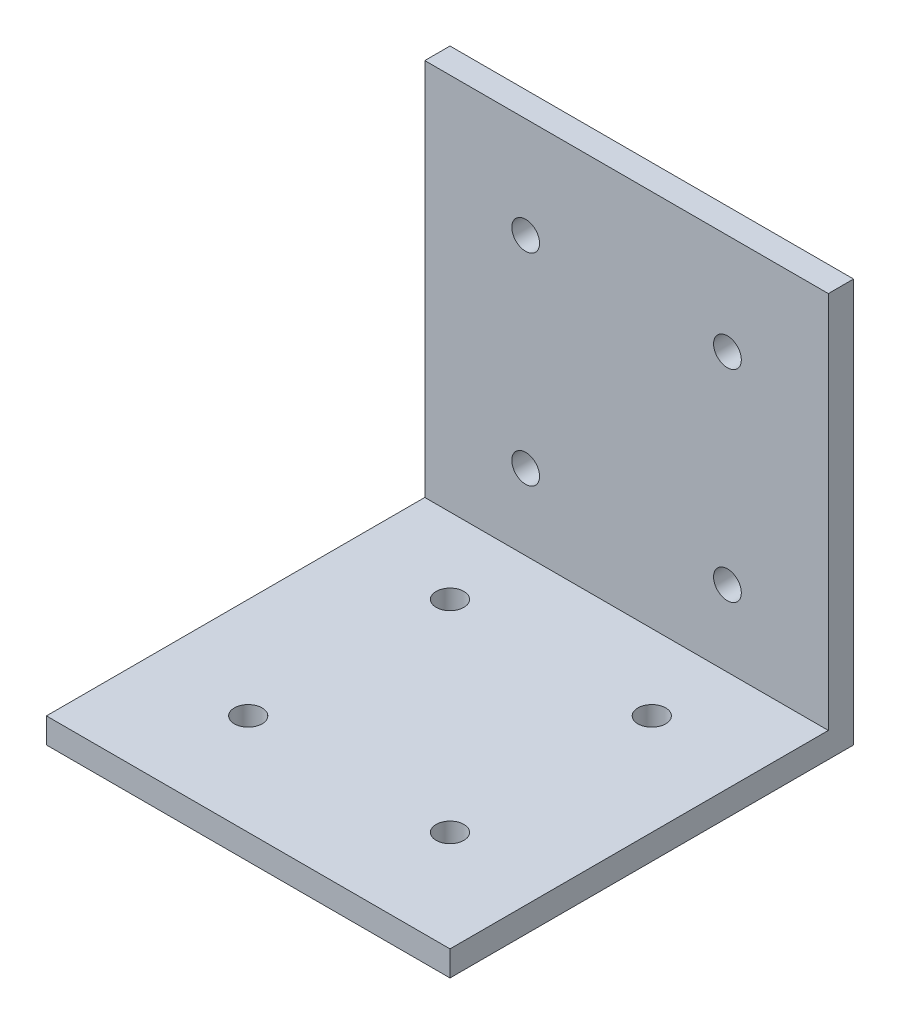
ISO-10303-21;
HEADER;
FILE_DESCRIPTION(('STEP AP214'),'2;1');
FILE_NAME('part.step','',(''),(''),'','','');
FILE_SCHEMA(('AUTOMOTIVE_DESIGN { 1 0 10303 214 1 1 1 1 }'));
ENDSEC;
DATA;
#1=APPLICATION_CONTEXT('core data for automotive mechanical design processes');
#2=APPLICATION_PROTOCOL_DEFINITION('international standard','automotive_design',2000,#1);
#3=PRODUCT_CONTEXT('',#1,'mechanical');
#4=PRODUCT('Part','Part','',(#3));
#5=PRODUCT_RELATED_PRODUCT_CATEGORY('part','',(#4));
#6=PRODUCT_DEFINITION_FORMATION('','',#4);
#7=PRODUCT_DEFINITION_CONTEXT('part definition',#1,'design');
#8=PRODUCT_DEFINITION('design','',#6,#7);
#9=PRODUCT_DEFINITION_SHAPE('','',#8);
#10=(LENGTH_UNIT() NAMED_UNIT(*) SI_UNIT(.MILLI.,.METRE.));
#11=(NAMED_UNIT(*) PLANE_ANGLE_UNIT() SI_UNIT($,.RADIAN.));
#12=(NAMED_UNIT(*) SI_UNIT($,.STERADIAN.) SOLID_ANGLE_UNIT());
#13=UNCERTAINTY_MEASURE_WITH_UNIT(LENGTH_MEASURE(1.E-05),#10,'distance_accuracy_value','');
#14=(GEOMETRIC_REPRESENTATION_CONTEXT(3) GLOBAL_UNCERTAINTY_ASSIGNED_CONTEXT((#13)) GLOBAL_UNIT_ASSIGNED_CONTEXT((#10,
#11,#12)) REPRESENTATION_CONTEXT('',''));
#15=CARTESIAN_POINT('',(0.,0.,0.));
#16=DIRECTION('',(0.,0.,1.));
#17=DIRECTION('',(1.,0.,0.));
#18=AXIS2_PLACEMENT_3D('',#15,#16,#17);
#19=CARTESIAN_POINT('',(0.,6.35,0.));
#20=DIRECTION('',(0.,1.,0.));
#21=DIRECTION('',(0.,0.,1.));
#22=AXIS2_PLACEMENT_3D('',#19,#20,#21);
#23=PLANE('',#22);
#24=DIRECTION('',(1.,0.,0.));
#25=VECTOR('',#24,1.);
#26=CARTESIAN_POINT('',(-50.8,6.35,-44.45));
#27=LINE('',#26,#25);
#28=CARTESIAN_POINT('',(-50.8,6.35,-44.45));
#29=VERTEX_POINT('',#28);
#30=CARTESIAN_POINT('',(50.8,6.35,-44.45));
#31=VERTEX_POINT('',#30);
#32=EDGE_CURVE('E55',#29,#31,#27,.T.);
#33=ORIENTED_EDGE('',*,*,#32,.F.);
#34=DIRECTION('',(0.,0.,1.));
#35=VECTOR('',#34,1.);
#36=CARTESIAN_POINT('',(-50.8,6.35,-50.8));
#37=LINE('',#36,#35);
#38=CARTESIAN_POINT('',(-50.8,6.35,50.8));
#39=VERTEX_POINT('',#38);
#40=EDGE_CURVE('E187',#29,#39,#37,.T.);
#41=ORIENTED_EDGE('',*,*,#40,.T.);
#42=DIRECTION('',(1.,0.,0.));
#43=VECTOR('',#42,1.);
#44=CARTESIAN_POINT('',(-50.8,6.35,50.8));
#45=LINE('',#44,#43);
#46=CARTESIAN_POINT('',(50.8,6.35,50.8));
#47=VERTEX_POINT('',#46);
#48=EDGE_CURVE('E61',#39,#47,#45,.T.);
#49=ORIENTED_EDGE('',*,*,#48,.T.);
#50=DIRECTION('',(0.,0.,-1.));
#51=VECTOR('',#50,1.);
#52=CARTESIAN_POINT('',(50.8,6.35,-50.8));
#53=LINE('',#52,#51);
#54=EDGE_CURVE('E91',#47,#31,#53,.T.);
#55=ORIENTED_EDGE('',*,*,#54,.T.);
#56=EDGE_LOOP('',(#33,#41,#49,#55));
#57=FACE_BOUND('',#56,.T.);
#58=CARTESIAN_POINT('',(25.4,6.35,25.4));
#59=DIRECTION('',(0.,1.,0.));
#60=DIRECTION('',(0.,0.,1.));
#61=AXIS2_PLACEMENT_3D('',#58,#59,#60);
#62=CIRCLE('',#61,3.4925);
#63=CARTESIAN_POINT('',(25.4,6.35,28.8925));
#64=VERTEX_POINT('',#63);
#65=EDGE_CURVE('E168',#64,#64,#62,.T.);
#66=ORIENTED_EDGE('',*,*,#65,.F.);
#67=EDGE_LOOP('',(#66));
#68=FACE_BOUND('',#67,.T.);
#69=CARTESIAN_POINT('',(-25.4,6.35,-25.4));
#70=DIRECTION('',(0.,1.,0.));
#71=DIRECTION('',(0.,0.,1.));
#72=AXIS2_PLACEMENT_3D('',#69,#70,#71);
#73=CIRCLE('',#72,3.4925);
#74=CARTESIAN_POINT('',(-25.4,6.35,-21.9075));
#75=VERTEX_POINT('',#74);
#76=EDGE_CURVE('E105',#75,#75,#73,.T.);
#77=ORIENTED_EDGE('',*,*,#76,.F.);
#78=EDGE_LOOP('',(#77));
#79=FACE_BOUND('',#78,.T.);
#80=CARTESIAN_POINT('',(25.4,6.35,-25.4));
#81=DIRECTION('',(0.,1.,0.));
#82=DIRECTION('',(0.,0.,1.));
#83=AXIS2_PLACEMENT_3D('',#80,#81,#82);
#84=CIRCLE('',#83,3.4925);
#85=CARTESIAN_POINT('',(25.4,6.35,-21.9075));
#86=VERTEX_POINT('',#85);
#87=EDGE_CURVE('E176',#86,#86,#84,.T.);
#88=ORIENTED_EDGE('',*,*,#87,.F.);
#89=EDGE_LOOP('',(#88));
#90=FACE_BOUND('',#89,.T.);
#91=CARTESIAN_POINT('',(-25.4,6.35,25.4));
#92=DIRECTION('',(0.,1.,0.));
#93=DIRECTION('',(0.,0.,1.));
#94=AXIS2_PLACEMENT_3D('',#91,#92,#93);
#95=CIRCLE('',#94,3.4925);
#96=CARTESIAN_POINT('',(-25.4,6.35,28.8925));
#97=VERTEX_POINT('',#96);
#98=EDGE_CURVE('E160',#97,#97,#95,.T.);
#99=ORIENTED_EDGE('',*,*,#98,.F.);
#100=EDGE_LOOP('',(#99));
#101=FACE_BOUND('',#100,.T.);
#102=ADVANCED_FACE('F39',(#57,#68,#79,#90,#101),#23,.T.);
#103=CARTESIAN_POINT('',(0.,0.,0.));
#104=DIRECTION('',(0.,1.,0.));
#105=DIRECTION('',(0.,0.,1.));
#106=AXIS2_PLACEMENT_3D('',#103,#104,#105);
#107=PLANE('',#106);
#108=DIRECTION('',(0.,0.,-1.));
#109=VECTOR('',#108,1.);
#110=CARTESIAN_POINT('',(50.8,0.,-50.8));
#111=LINE('',#110,#109);
#112=CARTESIAN_POINT('',(50.8,0.,50.8));
#113=VERTEX_POINT('',#112);
#114=CARTESIAN_POINT('',(50.8,0.,-50.8));
#115=VERTEX_POINT('',#114);
#116=EDGE_CURVE('E97',#113,#115,#111,.T.);
#117=ORIENTED_EDGE('',*,*,#116,.F.);
#118=DIRECTION('',(1.,0.,0.));
#119=VECTOR('',#118,1.);
#120=CARTESIAN_POINT('',(-50.8,0.,50.8));
#121=LINE('',#120,#119);
#122=CARTESIAN_POINT('',(-50.8,0.,50.8));
#123=VERTEX_POINT('',#122);
#124=EDGE_CURVE('E80',#123,#113,#121,.T.);
#125=ORIENTED_EDGE('',*,*,#124,.F.);
#126=DIRECTION('',(0.,0.,1.));
#127=VECTOR('',#126,1.);
#128=CARTESIAN_POINT('',(-50.8,0.,-50.8));
#129=LINE('',#128,#127);
#130=CARTESIAN_POINT('',(-50.8,0.,-50.8));
#131=VERTEX_POINT('',#130);
#132=EDGE_CURVE('E92',#131,#123,#129,.T.);
#133=ORIENTED_EDGE('',*,*,#132,.F.);
#134=DIRECTION('',(-1.,0.,0.));
#135=VECTOR('',#134,1.);
#136=CARTESIAN_POINT('',(-50.8,0.,-50.8));
#137=LINE('',#136,#135);
#138=EDGE_CURVE('E103',#115,#131,#137,.T.);
#139=ORIENTED_EDGE('',*,*,#138,.F.);
#140=EDGE_LOOP('',(#117,#125,#133,#139));
#141=FACE_BOUND('',#140,.T.);
#142=CARTESIAN_POINT('',(-25.4,0.,-25.4));
#143=DIRECTION('',(0.,1.,0.));
#144=DIRECTION('',(0.,0.,1.));
#145=AXIS2_PLACEMENT_3D('',#142,#143,#144);
#146=CIRCLE('',#145,3.4925);
#147=CARTESIAN_POINT('',(-25.4,0.,-21.9075));
#148=VERTEX_POINT('',#147);
#149=EDGE_CURVE('E111',#148,#148,#146,.T.);
#150=ORIENTED_EDGE('',*,*,#149,.T.);
#151=EDGE_LOOP('',(#150));
#152=FACE_BOUND('',#151,.T.);
#153=CARTESIAN_POINT('',(25.4,0.,-25.4));
#154=DIRECTION('',(0.,1.,0.));
#155=DIRECTION('',(0.,0.,1.));
#156=AXIS2_PLACEMENT_3D('',#153,#154,#155);
#157=CIRCLE('',#156,3.4925);
#158=CARTESIAN_POINT('',(25.4,0.,-21.9075));
#159=VERTEX_POINT('',#158);
#160=EDGE_CURVE('E172',#159,#159,#157,.T.);
#161=ORIENTED_EDGE('',*,*,#160,.T.);
#162=EDGE_LOOP('',(#161));
#163=FACE_BOUND('',#162,.T.);
#164=CARTESIAN_POINT('',(25.4,0.,25.4));
#165=DIRECTION('',(0.,1.,0.));
#166=DIRECTION('',(0.,0.,1.));
#167=AXIS2_PLACEMENT_3D('',#164,#165,#166);
#168=CIRCLE('',#167,3.4925);
#169=CARTESIAN_POINT('',(25.4,0.,28.8925));
#170=VERTEX_POINT('',#169);
#171=EDGE_CURVE('E164',#170,#170,#168,.T.);
#172=ORIENTED_EDGE('',*,*,#171,.T.);
#173=EDGE_LOOP('',(#172));
#174=FACE_BOUND('',#173,.T.);
#175=CARTESIAN_POINT('',(-25.4,0.,25.4));
#176=DIRECTION('',(0.,1.,0.));
#177=DIRECTION('',(0.,0.,1.));
#178=AXIS2_PLACEMENT_3D('',#175,#176,#177);
#179=CIRCLE('',#178,3.4925);
#180=CARTESIAN_POINT('',(-25.4,0.,28.8925));
#181=VERTEX_POINT('',#180);
#182=EDGE_CURVE('E159',#181,#181,#179,.T.);
#183=ORIENTED_EDGE('',*,*,#182,.T.);
#184=EDGE_LOOP('',(#183));
#185=FACE_BOUND('',#184,.T.);
#186=ADVANCED_FACE('F101',(#141,#152,#163,#174,#185),#107,.F.);
#187=CARTESIAN_POINT('',(50.8,6.35,-50.8));
#188=DIRECTION('',(-1.,0.,0.));
#189=DIRECTION('',(0.,0.,1.));
#190=AXIS2_PLACEMENT_3D('',#187,#188,#189);
#191=PLANE('',#190);
#192=ORIENTED_EDGE('',*,*,#116,.T.);
#193=DIRECTION('',(0.,-1.,0.));
#194=VECTOR('',#193,1.);
#195=CARTESIAN_POINT('',(50.8,6.35,-50.8));
#196=LINE('',#195,#194);
#197=CARTESIAN_POINT('',(50.8,101.6,-50.8));
#198=VERTEX_POINT('',#197);
#199=EDGE_CURVE('E11',#198,#115,#196,.T.);
#200=ORIENTED_EDGE('',*,*,#199,.F.);
#201=DIRECTION('',(0.,0.,-1.));
#202=VECTOR('',#201,1.);
#203=CARTESIAN_POINT('',(50.8,101.6,-50.8));
#204=LINE('',#203,#202);
#205=CARTESIAN_POINT('',(50.8,101.6,-44.45));
#206=VERTEX_POINT('',#205);
#207=EDGE_CURVE('E141',#206,#198,#204,.T.);
#208=ORIENTED_EDGE('',*,*,#207,.F.);
#209=DIRECTION('',(0.,-1.,0.));
#210=VECTOR('',#209,1.);
#211=CARTESIAN_POINT('',(50.8,101.6,-44.45));
#212=LINE('',#211,#210);
#213=EDGE_CURVE('E143',#206,#31,#212,.T.);
#214=ORIENTED_EDGE('',*,*,#213,.T.);
#215=ORIENTED_EDGE('',*,*,#54,.F.);
#216=DIRECTION('',(0.,-1.,0.));
#217=VECTOR('',#216,1.);
#218=CARTESIAN_POINT('',(50.8,6.35,50.8));
#219=LINE('',#218,#217);
#220=EDGE_CURVE('E83',#47,#113,#219,.T.);
#221=ORIENTED_EDGE('',*,*,#220,.T.);
#222=EDGE_LOOP('',(#192,#200,#208,#214,#215,#221));
#223=FACE_BOUND('',#222,.T.);
#224=ADVANCED_FACE('F41',(#223),#191,.F.);
#225=CARTESIAN_POINT('',(-50.8,6.35,-50.8));
#226=DIRECTION('',(0.,0.,1.));
#227=DIRECTION('',(1.,0.,0.));
#228=AXIS2_PLACEMENT_3D('',#225,#226,#227);
#229=PLANE('',#228);
#230=CARTESIAN_POINT('',(25.4,76.2,-50.8));
#231=DIRECTION('',(0.,0.,-1.));
#232=DIRECTION('',(-1.,0.,0.));
#233=AXIS2_PLACEMENT_3D('',#230,#231,#232);
#234=CIRCLE('',#233,3.4925);
#235=CARTESIAN_POINT('',(21.9075,76.2,-50.8));
#236=VERTEX_POINT('',#235);
#237=EDGE_CURVE('E214',#236,#236,#234,.T.);
#238=ORIENTED_EDGE('',*,*,#237,.F.);
#239=EDGE_LOOP('',(#238));
#240=FACE_BOUND('',#239,.T.);
#241=CARTESIAN_POINT('',(-25.4,25.4,-50.8));
#242=DIRECTION('',(0.,0.,-1.));
#243=DIRECTION('',(-1.,0.,0.));
#244=AXIS2_PLACEMENT_3D('',#241,#242,#243);
#245=CIRCLE('',#244,3.4925);
#246=CARTESIAN_POINT('',(-28.8925,25.4,-50.8));
#247=VERTEX_POINT('',#246);
#248=EDGE_CURVE('E215',#247,#247,#245,.T.);
#249=ORIENTED_EDGE('',*,*,#248,.F.);
#250=EDGE_LOOP('',(#249));
#251=FACE_BOUND('',#250,.T.);
#252=CARTESIAN_POINT('',(25.4,25.4,-50.8));
#253=DIRECTION('',(0.,0.,-1.));
#254=DIRECTION('',(-1.,0.,0.));
#255=AXIS2_PLACEMENT_3D('',#252,#253,#254);
#256=CIRCLE('',#255,3.4925);
#257=CARTESIAN_POINT('',(21.9075,25.4,-50.8));
#258=VERTEX_POINT('',#257);
#259=EDGE_CURVE('E229',#258,#258,#256,.T.);
#260=ORIENTED_EDGE('',*,*,#259,.F.);
#261=EDGE_LOOP('',(#260));
#262=FACE_BOUND('',#261,.T.);
#263=CARTESIAN_POINT('',(-25.4,76.2,-50.8));
#264=DIRECTION('',(0.,0.,-1.));
#265=DIRECTION('',(-1.,0.,0.));
#266=AXIS2_PLACEMENT_3D('',#263,#264,#265);
#267=CIRCLE('',#266,3.4925);
#268=CARTESIAN_POINT('',(-28.8925,76.2,-50.8));
#269=VERTEX_POINT('',#268);
#270=EDGE_CURVE('E205',#269,#269,#267,.T.);
#271=ORIENTED_EDGE('',*,*,#270,.F.);
#272=EDGE_LOOP('',(#271));
#273=FACE_BOUND('',#272,.T.);
#274=ORIENTED_EDGE('',*,*,#138,.T.);
#275=DIRECTION('',(0.,-1.,0.));
#276=VECTOR('',#275,1.);
#277=CARTESIAN_POINT('',(-50.8,6.35,-50.8));
#278=LINE('',#277,#276);
#279=CARTESIAN_POINT('',(-50.8,101.6,-50.8));
#280=VERTEX_POINT('',#279);
#281=EDGE_CURVE('E48',#280,#131,#278,.T.);
#282=ORIENTED_EDGE('',*,*,#281,.F.);
#283=DIRECTION('',(-1.,0.,0.));
#284=VECTOR('',#283,1.);
#285=CARTESIAN_POINT('',(-50.8,101.6,-50.8));
#286=LINE('',#285,#284);
#287=EDGE_CURVE('E133',#198,#280,#286,.T.);
#288=ORIENTED_EDGE('',*,*,#287,.F.);
#289=ORIENTED_EDGE('',*,*,#199,.T.);
#290=EDGE_LOOP('',(#274,#282,#288,#289));
#291=FACE_BOUND('',#290,.T.);
#292=ADVANCED_FACE('F131',(#240,#251,#262,#273,#291),#229,.F.);
#293=CARTESIAN_POINT('',(-50.8,6.35,-50.8));
#294=DIRECTION('',(1.,0.,0.));
#295=DIRECTION('',(0.,0.,-1.));
#296=AXIS2_PLACEMENT_3D('',#293,#294,#295);
#297=PLANE('',#296);
#298=ORIENTED_EDGE('',*,*,#132,.T.);
#299=DIRECTION('',(0.,-1.,0.));
#300=VECTOR('',#299,1.);
#301=CARTESIAN_POINT('',(-50.8,6.35,50.8));
#302=LINE('',#301,#300);
#303=EDGE_CURVE('E86',#39,#123,#302,.T.);
#304=ORIENTED_EDGE('',*,*,#303,.F.);
#305=ORIENTED_EDGE('',*,*,#40,.F.);
#306=DIRECTION('',(0.,-1.,0.));
#307=VECTOR('',#306,1.);
#308=CARTESIAN_POINT('',(-50.8,101.6,-44.45));
#309=LINE('',#308,#307);
#310=CARTESIAN_POINT('',(-50.8,101.6,-44.45));
#311=VERTEX_POINT('',#310);
#312=EDGE_CURVE('E147',#311,#29,#309,.T.);
#313=ORIENTED_EDGE('',*,*,#312,.F.);
#314=DIRECTION('',(0.,0.,1.));
#315=VECTOR('',#314,1.);
#316=CARTESIAN_POINT('',(-50.8,101.6,-50.8));
#317=LINE('',#316,#315);
#318=EDGE_CURVE('E127',#280,#311,#317,.T.);
#319=ORIENTED_EDGE('',*,*,#318,.F.);
#320=ORIENTED_EDGE('',*,*,#281,.T.);
#321=EDGE_LOOP('',(#298,#304,#305,#313,#319,#320));
#322=FACE_BOUND('',#321,.T.);
#323=ADVANCED_FACE('F124',(#322),#297,.F.);
#324=CARTESIAN_POINT('',(-50.8,6.35,50.8));
#325=DIRECTION('',(0.,0.,-1.));
#326=DIRECTION('',(-1.,0.,0.));
#327=AXIS2_PLACEMENT_3D('',#324,#325,#326);
#328=PLANE('',#327);
#329=ORIENTED_EDGE('',*,*,#124,.T.);
#330=ORIENTED_EDGE('',*,*,#220,.F.);
#331=ORIENTED_EDGE('',*,*,#48,.F.);
#332=ORIENTED_EDGE('',*,*,#303,.T.);
#333=EDGE_LOOP('',(#329,#330,#331,#332));
#334=FACE_BOUND('',#333,.T.);
#335=ADVANCED_FACE('F82',(#334),#328,.F.);
#336=CARTESIAN_POINT('',(-25.4,6.35,-25.4));
#337=DIRECTION('',(0.,-1.,0.));
#338=DIRECTION('',(0.,0.,-1.));
#339=AXIS2_PLACEMENT_3D('',#336,#337,#338);
#340=CYLINDRICAL_SURFACE('',#339,3.4925);
#341=ORIENTED_EDGE('',*,*,#76,.T.);
#342=EDGE_LOOP('',(#341));
#343=FACE_BOUND('',#342,.T.);
#344=ORIENTED_EDGE('',*,*,#149,.F.);
#345=EDGE_LOOP('',(#344));
#346=FACE_BOUND('',#345,.T.);
#347=ADVANCED_FACE('F261',(#343,#346),#340,.F.);
#348=CARTESIAN_POINT('',(25.4,6.35,-25.4));
#349=DIRECTION('',(0.,-1.,0.));
#350=DIRECTION('',(0.,0.,-1.));
#351=AXIS2_PLACEMENT_3D('',#348,#349,#350);
#352=CYLINDRICAL_SURFACE('',#351,3.4925);
#353=ORIENTED_EDGE('',*,*,#87,.T.);
#354=EDGE_LOOP('',(#353));
#355=FACE_BOUND('',#354,.T.);
#356=ORIENTED_EDGE('',*,*,#160,.F.);
#357=EDGE_LOOP('',(#356));
#358=FACE_BOUND('',#357,.T.);
#359=ADVANCED_FACE('F285',(#355,#358),#352,.F.);
#360=CARTESIAN_POINT('',(25.4,6.35,25.4));
#361=DIRECTION('',(0.,-1.,0.));
#362=DIRECTION('',(0.,0.,-1.));
#363=AXIS2_PLACEMENT_3D('',#360,#361,#362);
#364=CYLINDRICAL_SURFACE('',#363,3.4925);
#365=ORIENTED_EDGE('',*,*,#65,.T.);
#366=EDGE_LOOP('',(#365));
#367=FACE_BOUND('',#366,.T.);
#368=ORIENTED_EDGE('',*,*,#171,.F.);
#369=EDGE_LOOP('',(#368));
#370=FACE_BOUND('',#369,.T.);
#371=ADVANCED_FACE('F292',(#367,#370),#364,.F.);
#372=CARTESIAN_POINT('',(-25.4,6.35,25.4));
#373=DIRECTION('',(0.,-1.,0.));
#374=DIRECTION('',(0.,0.,-1.));
#375=AXIS2_PLACEMENT_3D('',#372,#373,#374);
#376=CYLINDRICAL_SURFACE('',#375,3.4925);
#377=ORIENTED_EDGE('',*,*,#98,.T.);
#378=EDGE_LOOP('',(#377));
#379=FACE_BOUND('',#378,.T.);
#380=ORIENTED_EDGE('',*,*,#182,.F.);
#381=EDGE_LOOP('',(#380));
#382=FACE_BOUND('',#381,.T.);
#383=ADVANCED_FACE('F299',(#379,#382),#376,.F.);
#384=CARTESIAN_POINT('',(-50.8,101.6,-44.45));
#385=DIRECTION('',(0.,0.,-1.));
#386=DIRECTION('',(-1.,0.,0.));
#387=AXIS2_PLACEMENT_3D('',#384,#385,#386);
#388=PLANE('',#387);
#389=CARTESIAN_POINT('',(25.4,76.2,-44.45));
#390=DIRECTION('',(0.,0.,-1.));
#391=DIRECTION('',(-1.,0.,0.));
#392=AXIS2_PLACEMENT_3D('',#389,#390,#391);
#393=CIRCLE('',#392,3.4925);
#394=CARTESIAN_POINT('',(21.9075,76.2,-44.45));
#395=VERTEX_POINT('',#394);
#396=EDGE_CURVE('E209',#395,#395,#393,.F.);
#397=ORIENTED_EDGE('',*,*,#396,.F.);
#398=EDGE_LOOP('',(#397));
#399=FACE_BOUND('',#398,.T.);
#400=CARTESIAN_POINT('',(-25.4,25.4,-44.45));
#401=DIRECTION('',(0.,0.,-1.));
#402=DIRECTION('',(-1.,0.,0.));
#403=AXIS2_PLACEMENT_3D('',#400,#401,#402);
#404=CIRCLE('',#403,3.4925);
#405=CARTESIAN_POINT('',(-28.8925,25.4,-44.45));
#406=VERTEX_POINT('',#405);
#407=EDGE_CURVE('E210',#406,#406,#404,.F.);
#408=ORIENTED_EDGE('',*,*,#407,.F.);
#409=EDGE_LOOP('',(#408));
#410=FACE_BOUND('',#409,.T.);
#411=CARTESIAN_POINT('',(25.4,25.4,-44.45));
#412=DIRECTION('',(0.,0.,-1.));
#413=DIRECTION('',(-1.,0.,0.));
#414=AXIS2_PLACEMENT_3D('',#411,#412,#413);
#415=CIRCLE('',#414,3.4925);
#416=CARTESIAN_POINT('',(21.9075,25.4,-44.45));
#417=VERTEX_POINT('',#416);
#418=EDGE_CURVE('E219',#417,#417,#415,.F.);
#419=ORIENTED_EDGE('',*,*,#418,.F.);
#420=EDGE_LOOP('',(#419));
#421=FACE_BOUND('',#420,.T.);
#422=CARTESIAN_POINT('',(-25.4,76.2,-44.45));
#423=DIRECTION('',(0.,0.,-1.));
#424=DIRECTION('',(-1.,0.,0.));
#425=AXIS2_PLACEMENT_3D('',#422,#423,#424);
#426=CIRCLE('',#425,3.4925);
#427=CARTESIAN_POINT('',(-28.8925,76.2,-44.45));
#428=VERTEX_POINT('',#427);
#429=EDGE_CURVE('E154',#428,#428,#426,.F.);
#430=ORIENTED_EDGE('',*,*,#429,.F.);
#431=EDGE_LOOP('',(#430));
#432=FACE_BOUND('',#431,.T.);
#433=ORIENTED_EDGE('',*,*,#32,.T.);
#434=ORIENTED_EDGE('',*,*,#213,.F.);
#435=DIRECTION('',(1.,0.,0.));
#436=VECTOR('',#435,1.);
#437=CARTESIAN_POINT('',(-50.8,101.6,-44.45));
#438=LINE('',#437,#436);
#439=EDGE_CURVE('E149',#311,#206,#438,.T.);
#440=ORIENTED_EDGE('',*,*,#439,.F.);
#441=ORIENTED_EDGE('',*,*,#312,.T.);
#442=EDGE_LOOP('',(#433,#434,#440,#441));
#443=FACE_BOUND('',#442,.T.);
#444=ADVANCED_FACE('F193',(#399,#410,#421,#432,#443),#388,.F.);
#445=CARTESIAN_POINT('',(0.,101.6,0.));
#446=DIRECTION('',(0.,1.,0.));
#447=DIRECTION('',(0.,0.,1.));
#448=AXIS2_PLACEMENT_3D('',#445,#446,#447);
#449=PLANE('',#448);
#450=ORIENTED_EDGE('',*,*,#318,.T.);
#451=ORIENTED_EDGE('',*,*,#439,.T.);
#452=ORIENTED_EDGE('',*,*,#207,.T.);
#453=ORIENTED_EDGE('',*,*,#287,.T.);
#454=EDGE_LOOP('',(#450,#451,#452,#453));
#455=FACE_BOUND('',#454,.T.);
#456=ADVANCED_FACE('F137',(#455),#449,.T.);
#457=CARTESIAN_POINT('',(-25.4,76.2,-34.5717182668239));
#458=DIRECTION('',(0.,0.,-1.));
#459=DIRECTION('',(-1.,0.,0.));
#460=AXIS2_PLACEMENT_3D('',#457,#458,#459);
#461=CYLINDRICAL_SURFACE('',#460,3.4925);
#462=ORIENTED_EDGE('',*,*,#429,.T.);
#463=EDGE_LOOP('',(#462));
#464=FACE_BOUND('',#463,.T.);
#465=ORIENTED_EDGE('',*,*,#270,.T.);
#466=EDGE_LOOP('',(#465));
#467=FACE_BOUND('',#466,.T.);
#468=ADVANCED_FACE('F241',(#464,#467),#461,.F.);
#469=CARTESIAN_POINT('',(25.4,25.4,-34.5717182668239));
#470=DIRECTION('',(0.,0.,-1.));
#471=DIRECTION('',(-1.,0.,0.));
#472=AXIS2_PLACEMENT_3D('',#469,#470,#471);
#473=CYLINDRICAL_SURFACE('',#472,3.4925);
#474=ORIENTED_EDGE('',*,*,#418,.T.);
#475=EDGE_LOOP('',(#474));
#476=FACE_BOUND('',#475,.T.);
#477=ORIENTED_EDGE('',*,*,#259,.T.);
#478=EDGE_LOOP('',(#477));
#479=FACE_BOUND('',#478,.T.);
#480=ADVANCED_FACE('F234',(#476,#479),#473,.F.);
#481=CARTESIAN_POINT('',(-25.4,25.4,-34.5717182668239));
#482=DIRECTION('',(0.,0.,-1.));
#483=DIRECTION('',(-1.,0.,0.));
#484=AXIS2_PLACEMENT_3D('',#481,#482,#483);
#485=CYLINDRICAL_SURFACE('',#484,3.4925);
#486=ORIENTED_EDGE('',*,*,#407,.T.);
#487=EDGE_LOOP('',(#486));
#488=FACE_BOUND('',#487,.T.);
#489=ORIENTED_EDGE('',*,*,#248,.T.);
#490=EDGE_LOOP('',(#489));
#491=FACE_BOUND('',#490,.T.);
#492=ADVANCED_FACE('F249',(#488,#491),#485,.F.);
#493=CARTESIAN_POINT('',(25.4,76.2,-34.5717182668239));
#494=DIRECTION('',(0.,0.,-1.));
#495=DIRECTION('',(-1.,0.,0.));
#496=AXIS2_PLACEMENT_3D('',#493,#494,#495);
#497=CYLINDRICAL_SURFACE('',#496,3.4925);
#498=ORIENTED_EDGE('',*,*,#396,.T.);
#499=EDGE_LOOP('',(#498));
#500=FACE_BOUND('',#499,.T.);
#501=ORIENTED_EDGE('',*,*,#237,.T.);
#502=EDGE_LOOP('',(#501));
#503=FACE_BOUND('',#502,.T.);
#504=ADVANCED_FACE('F378',(#500,#503),#497,.F.);
#505=CLOSED_SHELL('',(#102,#186,#224,#292,#323,#335,#347,#359,#371,#383,#444,#456,#468,#480,
#492,#504));
#506=MANIFOLD_SOLID_BREP('B2',#505);
#507=ADVANCED_BREP_SHAPE_REPRESENTATION('',(#18,#506),#14);
#508=SHAPE_DEFINITION_REPRESENTATION(#9,#507);
ENDSEC;
END-ISO-10303-21;
